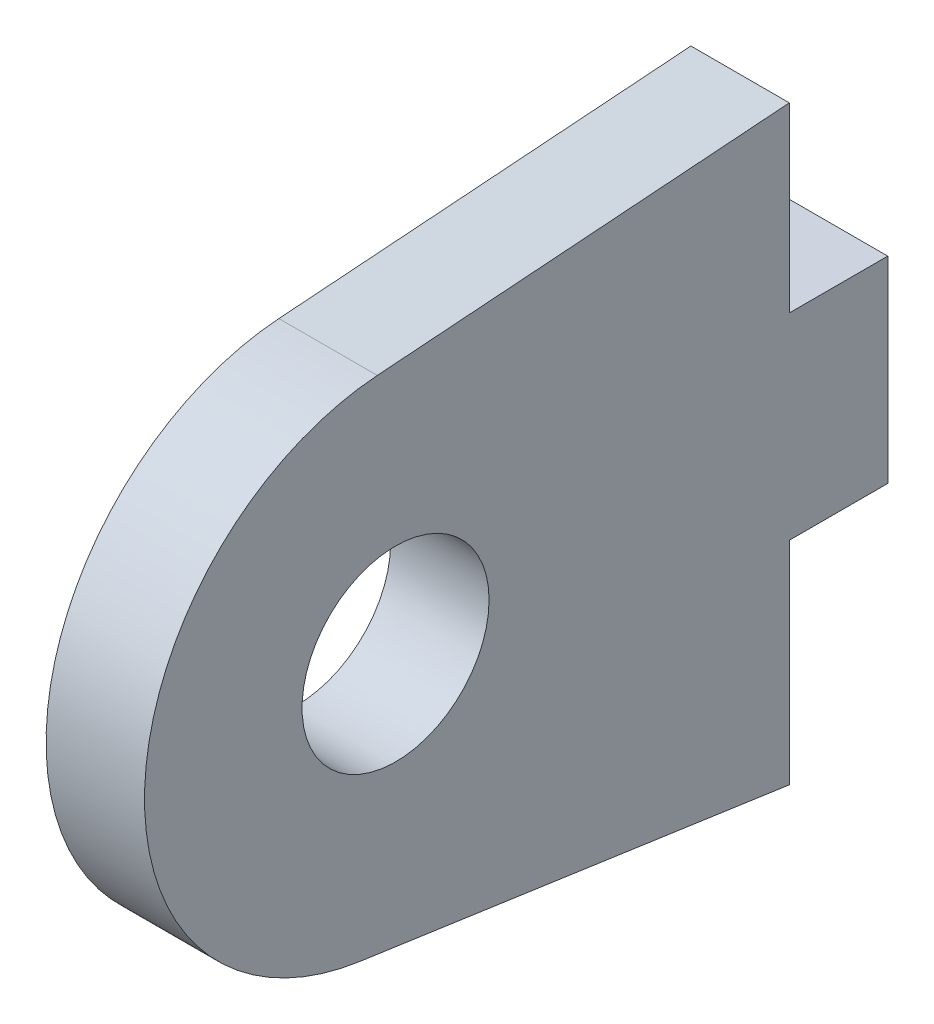
ISO-10303-21;
HEADER;
FILE_DESCRIPTION(('STEP AP214'),'2;1');
FILE_NAME('part.step','',(''),(''),'','','');
FILE_SCHEMA(('AUTOMOTIVE_DESIGN { 1 0 10303 214 1 1 1 1 }'));
ENDSEC;
DATA;
#1=APPLICATION_CONTEXT('core data for automotive mechanical design processes');
#2=APPLICATION_PROTOCOL_DEFINITION('international standard','automotive_design',2000,#1);
#3=PRODUCT_CONTEXT('',#1,'mechanical');
#4=PRODUCT('Part','Part','',(#3));
#5=PRODUCT_RELATED_PRODUCT_CATEGORY('part','',(#4));
#6=PRODUCT_DEFINITION_FORMATION('','',#4);
#7=PRODUCT_DEFINITION_CONTEXT('part definition',#1,'design');
#8=PRODUCT_DEFINITION('design','',#6,#7);
#9=PRODUCT_DEFINITION_SHAPE('','',#8);
#10=(LENGTH_UNIT() NAMED_UNIT(*) SI_UNIT(.MILLI.,.METRE.));
#11=(NAMED_UNIT(*) PLANE_ANGLE_UNIT() SI_UNIT($,.RADIAN.));
#12=(NAMED_UNIT(*) SI_UNIT($,.STERADIAN.) SOLID_ANGLE_UNIT());
#13=UNCERTAINTY_MEASURE_WITH_UNIT(LENGTH_MEASURE(1.E-05),#10,'distance_accuracy_value','');
#14=(GEOMETRIC_REPRESENTATION_CONTEXT(3) GLOBAL_UNCERTAINTY_ASSIGNED_CONTEXT((#13)) GLOBAL_UNIT_ASSIGNED_CONTEXT((#10,
#11,#12)) REPRESENTATION_CONTEXT('',''));
#15=CARTESIAN_POINT('',(0.,0.,0.));
#16=DIRECTION('',(0.,0.,1.));
#17=DIRECTION('',(1.,0.,0.));
#18=AXIS2_PLACEMENT_3D('',#15,#16,#17);
#19=CARTESIAN_POINT('',(2.5,0.,20.));
#20=DIRECTION('',(1.,0.,0.));
#21=DIRECTION('',(0.,0.,-1.));
#22=AXIS2_PLACEMENT_3D('',#19,#20,#21);
#23=PLANE('',#22);
#24=DIRECTION('',(0.,1.,0.));
#25=VECTOR('',#24,1.);
#26=CARTESIAN_POINT('',(2.5,5.,0.));
#27=LINE('',#26,#25);
#28=CARTESIAN_POINT('',(2.5,5.,0.));
#29=VERTEX_POINT('',#28);
#30=CARTESIAN_POINT('',(2.5,14.2422824883128,0.));
#31=VERTEX_POINT('',#30);
#32=EDGE_CURVE('E165',#29,#31,#27,.T.);
#33=ORIENTED_EDGE('',*,*,#32,.T.);
#34=DIRECTION('',(0.,-0.0727282972971378,0.997351790880359));
#35=VECTOR('',#34,1.);
#36=CARTESIAN_POINT('',(2.5,14.2422824883128,0.));
#37=LINE('',#36,#35);
#38=CARTESIAN_POINT('',(2.5,12.7162353337246,20.9272857905385));
#39=VERTEX_POINT('',#38);
#40=EDGE_CURVE('E102',#31,#39,#37,.T.);
#41=ORIENTED_EDGE('',*,*,#40,.T.);
#42=CARTESIAN_POINT('',(2.5,0.,20.));
#43=DIRECTION('',(1.,0.,0.));
#44=DIRECTION('',(0.,0.,-1.));
#45=AXIS2_PLACEMENT_3D('',#42,#43,#44);
#46=CIRCLE('',#45,12.75);
#47=CARTESIAN_POINT('',(2.5,-12.6201385773802,21.8151039330352));
#48=VERTEX_POINT('',#47);
#49=EDGE_CURVE('E157',#39,#48,#46,.T.);
#50=ORIENTED_EDGE('',*,*,#49,.T.);
#51=DIRECTION('',(0.,-0.142361092787071,-0.989814790382762));
#52=VECTOR('',#51,1.);
#53=CARTESIAN_POINT('',(2.5,-15.7577175116872,0.));
#54=LINE('',#53,#52);
#55=CARTESIAN_POINT('',(2.5,-15.7577175116872,0.));
#56=VERTEX_POINT('',#55);
#57=EDGE_CURVE('E153',#48,#56,#54,.T.);
#58=ORIENTED_EDGE('',*,*,#57,.T.);
#59=DIRECTION('',(0.,1.,0.));
#60=VECTOR('',#59,1.);
#61=CARTESIAN_POINT('',(2.5,-15.7577175116872,0.));
#62=LINE('',#61,#60);
#63=CARTESIAN_POINT('',(2.5,-5.,0.));
#64=VERTEX_POINT('',#63);
#65=EDGE_CURVE('E121',#56,#64,#62,.T.);
#66=ORIENTED_EDGE('',*,*,#65,.T.);
#67=DIRECTION('',(0.,0.,-1.));
#68=VECTOR('',#67,1.);
#69=CARTESIAN_POINT('',(2.5,-5.,-5.));
#70=LINE('',#69,#68);
#71=CARTESIAN_POINT('',(2.5,-5.,-5.));
#72=VERTEX_POINT('',#71);
#73=EDGE_CURVE('E115',#64,#72,#70,.T.);
#74=ORIENTED_EDGE('',*,*,#73,.T.);
#75=DIRECTION('',(0.,1.,0.));
#76=VECTOR('',#75,1.);
#77=CARTESIAN_POINT('',(2.5,5.,-5.));
#78=LINE('',#77,#76);
#79=CARTESIAN_POINT('',(2.5,5.,-5.));
#80=VERTEX_POINT('',#79);
#81=EDGE_CURVE('E119',#72,#80,#78,.T.);
#82=ORIENTED_EDGE('',*,*,#81,.T.);
#83=DIRECTION('',(0.,0.,1.));
#84=VECTOR('',#83,1.);
#85=CARTESIAN_POINT('',(2.5,5.,-5.));
#86=LINE('',#85,#84);
#87=EDGE_CURVE('E59',#80,#29,#86,.T.);
#88=ORIENTED_EDGE('',*,*,#87,.T.);
#89=EDGE_LOOP('',(#33,#41,#50,#58,#66,#74,#82,#88));
#90=FACE_BOUND('',#89,.T.);
#91=CARTESIAN_POINT('',(2.5,0.,20.));
#92=DIRECTION('',(1.,0.,0.));
#93=DIRECTION('',(0.,0.,-1.));
#94=AXIS2_PLACEMENT_3D('',#91,#92,#93);
#95=CIRCLE('',#94,4.75);
#96=CARTESIAN_POINT('',(2.5,0.,15.25));
#97=VERTEX_POINT('',#96);
#98=EDGE_CURVE('E171',#97,#97,#95,.T.);
#99=ORIENTED_EDGE('',*,*,#98,.F.);
#100=EDGE_LOOP('',(#99));
#101=FACE_BOUND('',#100,.T.);
#102=ADVANCED_FACE('F42',(#90,#101),#23,.T.);
#103=CARTESIAN_POINT('',(-2.5,0.,20.));
#104=DIRECTION('',(1.,0.,0.));
#105=DIRECTION('',(0.,0.,-1.));
#106=AXIS2_PLACEMENT_3D('',#103,#104,#105);
#107=PLANE('',#106);
#108=DIRECTION('',(0.,1.,0.));
#109=VECTOR('',#108,1.);
#110=CARTESIAN_POINT('',(-2.5,5.,0.));
#111=LINE('',#110,#109);
#112=CARTESIAN_POINT('',(-2.5,5.,0.));
#113=VERTEX_POINT('',#112);
#114=CARTESIAN_POINT('',(-2.5,14.2422824883128,0.));
#115=VERTEX_POINT('',#114);
#116=EDGE_CURVE('E175',#113,#115,#111,.T.);
#117=ORIENTED_EDGE('',*,*,#116,.F.);
#118=DIRECTION('',(0.,0.,1.));
#119=VECTOR('',#118,1.);
#120=CARTESIAN_POINT('',(-2.5,5.,-5.));
#121=LINE('',#120,#119);
#122=CARTESIAN_POINT('',(-2.5,5.,-5.));
#123=VERTEX_POINT('',#122);
#124=EDGE_CURVE('E94',#123,#113,#121,.T.);
#125=ORIENTED_EDGE('',*,*,#124,.F.);
#126=DIRECTION('',(0.,1.,0.));
#127=VECTOR('',#126,1.);
#128=CARTESIAN_POINT('',(-2.5,5.,-5.));
#129=LINE('',#128,#127);
#130=CARTESIAN_POINT('',(-2.5,-5.,-5.));
#131=VERTEX_POINT('',#130);
#132=EDGE_CURVE('E88',#131,#123,#129,.T.);
#133=ORIENTED_EDGE('',*,*,#132,.F.);
#134=DIRECTION('',(0.,0.,-1.));
#135=VECTOR('',#134,1.);
#136=CARTESIAN_POINT('',(-2.5,-5.,-5.));
#137=LINE('',#136,#135);
#138=CARTESIAN_POINT('',(-2.5,-5.,0.));
#139=VERTEX_POINT('',#138);
#140=EDGE_CURVE('E130',#139,#131,#137,.T.);
#141=ORIENTED_EDGE('',*,*,#140,.F.);
#142=DIRECTION('',(0.,1.,0.));
#143=VECTOR('',#142,1.);
#144=CARTESIAN_POINT('',(-2.5,-15.7577175116872,0.));
#145=LINE('',#144,#143);
#146=CARTESIAN_POINT('',(-2.5,-15.7577175116872,0.));
#147=VERTEX_POINT('',#146);
#148=EDGE_CURVE('E189',#147,#139,#145,.T.);
#149=ORIENTED_EDGE('',*,*,#148,.F.);
#150=DIRECTION('',(0.,-0.142361092787071,-0.989814790382762));
#151=VECTOR('',#150,1.);
#152=CARTESIAN_POINT('',(-2.5,-15.7577175116872,0.));
#153=LINE('',#152,#151);
#154=CARTESIAN_POINT('',(-2.5,-12.6201385773802,21.8151039330352));
#155=VERTEX_POINT('',#154);
#156=EDGE_CURVE('E187',#155,#147,#153,.T.);
#157=ORIENTED_EDGE('',*,*,#156,.F.);
#158=CARTESIAN_POINT('',(-2.5,0.,20.));
#159=DIRECTION('',(1.,0.,0.));
#160=DIRECTION('',(0.,0.,-1.));
#161=AXIS2_PLACEMENT_3D('',#158,#159,#160);
#162=CIRCLE('',#161,12.75);
#163=CARTESIAN_POINT('',(-2.5,12.7162353337246,20.9272857905385));
#164=VERTEX_POINT('',#163);
#165=EDGE_CURVE('E183',#164,#155,#162,.T.);
#166=ORIENTED_EDGE('',*,*,#165,.F.);
#167=DIRECTION('',(0.,-0.0727282972971378,0.997351790880359));
#168=VECTOR('',#167,1.);
#169=CARTESIAN_POINT('',(-2.5,14.2422824883128,0.));
#170=LINE('',#169,#168);
#171=EDGE_CURVE('E179',#115,#164,#170,.T.);
#172=ORIENTED_EDGE('',*,*,#171,.F.);
#173=EDGE_LOOP('',(#117,#125,#133,#141,#149,#157,#166,#172));
#174=FACE_BOUND('',#173,.T.);
#175=CARTESIAN_POINT('',(-2.5,0.,20.));
#176=DIRECTION('',(1.,0.,0.));
#177=DIRECTION('',(0.,0.,-1.));
#178=AXIS2_PLACEMENT_3D('',#175,#176,#177);
#179=CIRCLE('',#178,4.75);
#180=CARTESIAN_POINT('',(-2.5,0.,15.25));
#181=VERTEX_POINT('',#180);
#182=EDGE_CURVE('E169',#181,#181,#179,.T.);
#183=ORIENTED_EDGE('',*,*,#182,.T.);
#184=EDGE_LOOP('',(#183));
#185=FACE_BOUND('',#184,.T.);
#186=ADVANCED_FACE('F210',(#174,#185),#107,.F.);
#187=CARTESIAN_POINT('',(2.5,5.,0.));
#188=DIRECTION('',(0.,0.,1.));
#189=DIRECTION('',(1.,0.,0.));
#190=AXIS2_PLACEMENT_3D('',#187,#188,#189);
#191=PLANE('',#190);
#192=ORIENTED_EDGE('',*,*,#116,.T.);
#193=DIRECTION('',(-1.,0.,0.));
#194=VECTOR('',#193,1.);
#195=CARTESIAN_POINT('',(2.5,14.2422824883128,0.));
#196=LINE('',#195,#194);
#197=EDGE_CURVE('E12',#31,#115,#196,.T.);
#198=ORIENTED_EDGE('',*,*,#197,.F.);
#199=ORIENTED_EDGE('',*,*,#32,.F.);
#200=DIRECTION('',(-1.,0.,0.));
#201=VECTOR('',#200,1.);
#202=CARTESIAN_POINT('',(2.5,5.,0.));
#203=LINE('',#202,#201);
#204=EDGE_CURVE('E138',#29,#113,#203,.T.);
#205=ORIENTED_EDGE('',*,*,#204,.T.);
#206=EDGE_LOOP('',(#192,#198,#199,#205));
#207=FACE_BOUND('',#206,.T.);
#208=ADVANCED_FACE('F44',(#207),#191,.F.);
#209=CARTESIAN_POINT('',(2.5,14.2422824883128,0.));
#210=DIRECTION('',(0.,-0.997351790880359,-0.0727282972971378));
#211=DIRECTION('',(0.,0.0727282972971378,-0.997351790880359));
#212=AXIS2_PLACEMENT_3D('',#209,#210,#211);
#213=PLANE('',#212);
#214=ORIENTED_EDGE('',*,*,#171,.T.);
#215=DIRECTION('',(-1.,0.,0.));
#216=VECTOR('',#215,1.);
#217=CARTESIAN_POINT('',(2.5,12.7162353337246,20.9272857905385));
#218=LINE('',#217,#216);
#219=EDGE_CURVE('E51',#39,#164,#218,.T.);
#220=ORIENTED_EDGE('',*,*,#219,.F.);
#221=ORIENTED_EDGE('',*,*,#40,.F.);
#222=ORIENTED_EDGE('',*,*,#197,.T.);
#223=EDGE_LOOP('',(#214,#220,#221,#222));
#224=FACE_BOUND('',#223,.T.);
#225=ADVANCED_FACE('F279',(#224),#213,.F.);
#226=CARTESIAN_POINT('',(2.5,0.,20.));
#227=DIRECTION('',(-1.,0.,0.));
#228=DIRECTION('',(0.,0.,1.));
#229=AXIS2_PLACEMENT_3D('',#226,#227,#228);
#230=CYLINDRICAL_SURFACE('',#229,12.75);
#231=ORIENTED_EDGE('',*,*,#165,.T.);
#232=DIRECTION('',(-1.,0.,0.));
#233=VECTOR('',#232,1.);
#234=CARTESIAN_POINT('',(2.5,-12.6201385773802,21.8151039330352));
#235=LINE('',#234,#233);
#236=EDGE_CURVE('E200',#48,#155,#235,.T.);
#237=ORIENTED_EDGE('',*,*,#236,.F.);
#238=ORIENTED_EDGE('',*,*,#49,.F.);
#239=ORIENTED_EDGE('',*,*,#219,.T.);
#240=EDGE_LOOP('',(#231,#237,#238,#239));
#241=FACE_BOUND('',#240,.T.);
#242=ADVANCED_FACE('F206',(#241),#230,.T.);
#243=CARTESIAN_POINT('',(2.5,-15.7577175116872,0.));
#244=DIRECTION('',(0.,0.989814790382762,-0.142361092787071));
#245=DIRECTION('',(0.,0.142361092787071,0.989814790382762));
#246=AXIS2_PLACEMENT_3D('',#243,#244,#245);
#247=PLANE('',#246);
#248=ORIENTED_EDGE('',*,*,#156,.T.);
#249=DIRECTION('',(-1.,0.,0.));
#250=VECTOR('',#249,1.);
#251=CARTESIAN_POINT('',(2.5,-15.7577175116872,0.));
#252=LINE('',#251,#250);
#253=EDGE_CURVE('E197',#56,#147,#252,.T.);
#254=ORIENTED_EDGE('',*,*,#253,.F.);
#255=ORIENTED_EDGE('',*,*,#57,.F.);
#256=ORIENTED_EDGE('',*,*,#236,.T.);
#257=EDGE_LOOP('',(#248,#254,#255,#256));
#258=FACE_BOUND('',#257,.T.);
#259=ADVANCED_FACE('F215',(#258),#247,.F.);
#260=CARTESIAN_POINT('',(2.5,-15.7577175116872,0.));
#261=DIRECTION('',(0.,0.,1.));
#262=DIRECTION('',(1.,0.,0.));
#263=AXIS2_PLACEMENT_3D('',#260,#261,#262);
#264=PLANE('',#263);
#265=ORIENTED_EDGE('',*,*,#148,.T.);
#266=DIRECTION('',(-1.,0.,0.));
#267=VECTOR('',#266,1.);
#268=CARTESIAN_POINT('',(2.5,-5.,0.));
#269=LINE('',#268,#267);
#270=EDGE_CURVE('E131',#64,#139,#269,.T.);
#271=ORIENTED_EDGE('',*,*,#270,.F.);
#272=ORIENTED_EDGE('',*,*,#65,.F.);
#273=ORIENTED_EDGE('',*,*,#253,.T.);
#274=EDGE_LOOP('',(#265,#271,#272,#273));
#275=FACE_BOUND('',#274,.T.);
#276=ADVANCED_FACE('F218',(#275),#264,.F.);
#277=CARTESIAN_POINT('',(2.5,-5.,-5.));
#278=DIRECTION('',(0.,1.,0.));
#279=DIRECTION('',(0.,0.,1.));
#280=AXIS2_PLACEMENT_3D('',#277,#278,#279);
#281=PLANE('',#280);
#282=ORIENTED_EDGE('',*,*,#140,.T.);
#283=DIRECTION('',(-1.,0.,0.));
#284=VECTOR('',#283,1.);
#285=CARTESIAN_POINT('',(2.5,-5.,-5.));
#286=LINE('',#285,#284);
#287=EDGE_CURVE('E127',#72,#131,#286,.T.);
#288=ORIENTED_EDGE('',*,*,#287,.F.);
#289=ORIENTED_EDGE('',*,*,#73,.F.);
#290=ORIENTED_EDGE('',*,*,#270,.T.);
#291=EDGE_LOOP('',(#282,#288,#289,#290));
#292=FACE_BOUND('',#291,.T.);
#293=ADVANCED_FACE('F128',(#292),#281,.F.);
#294=CARTESIAN_POINT('',(2.5,5.,-5.));
#295=DIRECTION('',(0.,0.,1.));
#296=DIRECTION('',(0.,-1.,0.));
#297=AXIS2_PLACEMENT_3D('',#294,#295,#296);
#298=PLANE('',#297);
#299=ORIENTED_EDGE('',*,*,#132,.T.);
#300=DIRECTION('',(-1.,0.,0.));
#301=VECTOR('',#300,1.);
#302=CARTESIAN_POINT('',(2.5,5.,-5.));
#303=LINE('',#302,#301);
#304=EDGE_CURVE('E132',#80,#123,#303,.T.);
#305=ORIENTED_EDGE('',*,*,#304,.F.);
#306=ORIENTED_EDGE('',*,*,#81,.F.);
#307=ORIENTED_EDGE('',*,*,#287,.T.);
#308=EDGE_LOOP('',(#299,#305,#306,#307));
#309=FACE_BOUND('',#308,.T.);
#310=ADVANCED_FACE('F134',(#309),#298,.F.);
#311=CARTESIAN_POINT('',(2.5,5.,-5.));
#312=DIRECTION('',(0.,-1.,0.));
#313=DIRECTION('',(0.,0.,-1.));
#314=AXIS2_PLACEMENT_3D('',#311,#312,#313);
#315=PLANE('',#314);
#316=ORIENTED_EDGE('',*,*,#124,.T.);
#317=ORIENTED_EDGE('',*,*,#204,.F.);
#318=ORIENTED_EDGE('',*,*,#87,.F.);
#319=ORIENTED_EDGE('',*,*,#304,.T.);
#320=EDGE_LOOP('',(#316,#317,#318,#319));
#321=FACE_BOUND('',#320,.T.);
#322=ADVANCED_FACE('F236',(#321),#315,.F.);
#323=CARTESIAN_POINT('',(2.5,0.,20.));
#324=DIRECTION('',(-1.,0.,0.));
#325=DIRECTION('',(0.,0.,1.));
#326=AXIS2_PLACEMENT_3D('',#323,#324,#325);
#327=CYLINDRICAL_SURFACE('',#326,4.75);
#328=ORIENTED_EDGE('',*,*,#98,.T.);
#329=EDGE_LOOP('',(#328));
#330=FACE_BOUND('',#329,.T.);
#331=ORIENTED_EDGE('',*,*,#182,.F.);
#332=EDGE_LOOP('',(#331));
#333=FACE_BOUND('',#332,.T.);
#334=ADVANCED_FACE('F234',(#330,#333),#327,.F.);
#335=CLOSED_SHELL('',(#102,#186,#208,#225,#242,#259,#276,#293,#310,#322,#334));
#336=MANIFOLD_SOLID_BREP('B2',#335);
#337=ADVANCED_BREP_SHAPE_REPRESENTATION('',(#18,#336),#14);
#338=SHAPE_DEFINITION_REPRESENTATION(#9,#337);
ENDSEC;
END-ISO-10303-21;
